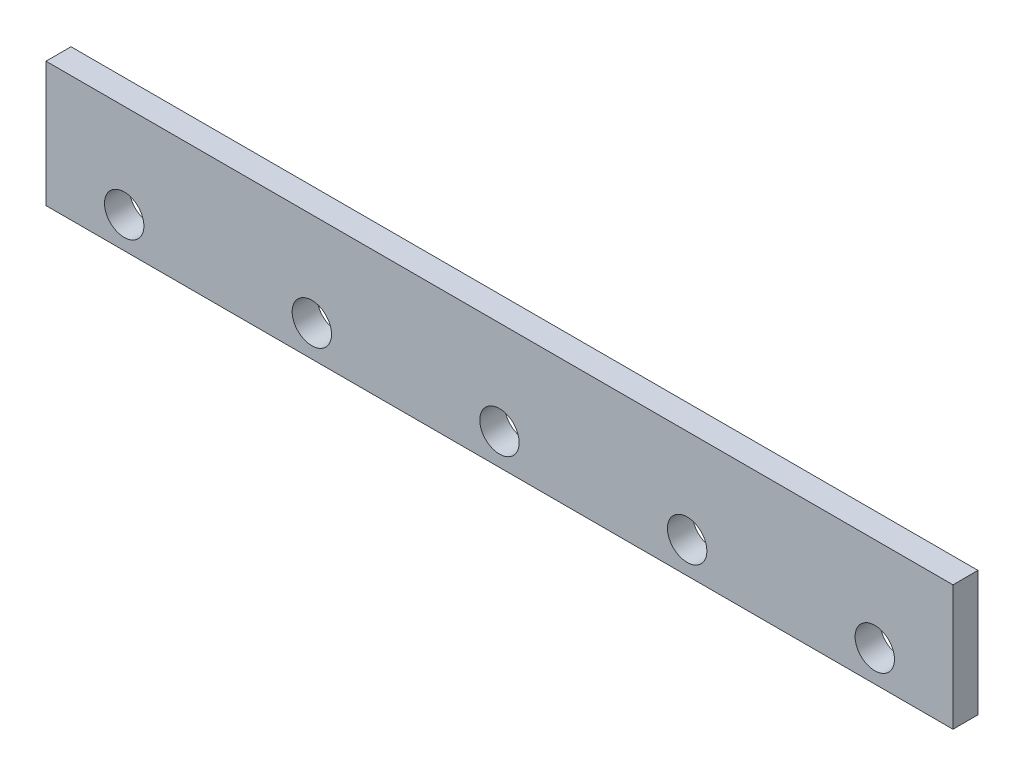
ISO-10303-21;
HEADER;
FILE_DESCRIPTION(('STEP AP214'),'2;1');
FILE_NAME('part.step','',(''),(''),'','','');
FILE_SCHEMA(('AUTOMOTIVE_DESIGN { 1 0 10303 214 1 1 1 1 }'));
ENDSEC;
DATA;
#1=APPLICATION_CONTEXT('core data for automotive mechanical design processes');
#2=APPLICATION_PROTOCOL_DEFINITION('international standard','automotive_design',2000,#1);
#3=PRODUCT_CONTEXT('',#1,'mechanical');
#4=PRODUCT('Part','Part','',(#3));
#5=PRODUCT_RELATED_PRODUCT_CATEGORY('part','',(#4));
#6=PRODUCT_DEFINITION_FORMATION('','',#4);
#7=PRODUCT_DEFINITION_CONTEXT('part definition',#1,'design');
#8=PRODUCT_DEFINITION('design','',#6,#7);
#9=PRODUCT_DEFINITION_SHAPE('','',#8);
#10=(LENGTH_UNIT() NAMED_UNIT(*) SI_UNIT(.MILLI.,.METRE.));
#11=(NAMED_UNIT(*) PLANE_ANGLE_UNIT() SI_UNIT($,.RADIAN.));
#12=(NAMED_UNIT(*) SI_UNIT($,.STERADIAN.) SOLID_ANGLE_UNIT());
#13=UNCERTAINTY_MEASURE_WITH_UNIT(LENGTH_MEASURE(1.E-05),#10,'distance_accuracy_value','');
#14=(GEOMETRIC_REPRESENTATION_CONTEXT(3) GLOBAL_UNCERTAINTY_ASSIGNED_CONTEXT((#13)) GLOBAL_UNIT_ASSIGNED_CONTEXT((#10,
#11,#12)) REPRESENTATION_CONTEXT('',''));
#15=CARTESIAN_POINT('',(0.,0.,0.));
#16=DIRECTION('',(0.,0.,1.));
#17=DIRECTION('',(1.,0.,0.));
#18=AXIS2_PLACEMENT_3D('',#15,#16,#17);
#19=CARTESIAN_POINT('',(0.,0.,16.));
#20=DIRECTION('',(0.,1.,0.));
#21=DIRECTION('',(0.,0.,1.));
#22=AXIS2_PLACEMENT_3D('',#19,#20,#21);
#23=PLANE('',#22);
#24=DIRECTION('',(1.,0.,0.));
#25=VECTOR('',#24,1.);
#26=CARTESIAN_POINT('',(0.,0.,0.));
#27=LINE('',#26,#25);
#28=CARTESIAN_POINT('',(0.,0.,0.));
#29=VERTEX_POINT('',#28);
#30=CARTESIAN_POINT('',(580.,0.,0.));
#31=VERTEX_POINT('',#30);
#32=EDGE_CURVE('E118',#29,#31,#27,.T.);
#33=ORIENTED_EDGE('',*,*,#32,.T.);
#34=DIRECTION('',(0.,0.,-1.));
#35=VECTOR('',#34,1.);
#36=CARTESIAN_POINT('',(580.,0.,16.));
#37=LINE('',#36,#35);
#38=CARTESIAN_POINT('',(580.,0.,16.));
#39=VERTEX_POINT('',#38);
#40=EDGE_CURVE('E11',#39,#31,#37,.T.);
#41=ORIENTED_EDGE('',*,*,#40,.F.);
#42=DIRECTION('',(1.,0.,0.));
#43=VECTOR('',#42,1.);
#44=CARTESIAN_POINT('',(0.,0.,16.));
#45=LINE('',#44,#43);
#46=CARTESIAN_POINT('',(0.,0.,16.));
#47=VERTEX_POINT('',#46);
#48=EDGE_CURVE('E89',#47,#39,#45,.T.);
#49=ORIENTED_EDGE('',*,*,#48,.F.);
#50=DIRECTION('',(0.,0.,-1.));
#51=VECTOR('',#50,1.);
#52=CARTESIAN_POINT('',(0.,0.,16.));
#53=LINE('',#52,#51);
#54=EDGE_CURVE('E56',#47,#29,#53,.T.);
#55=ORIENTED_EDGE('',*,*,#54,.T.);
#56=EDGE_LOOP('',(#33,#41,#49,#55));
#57=FACE_BOUND('',#56,.T.);
#58=ADVANCED_FACE('F39',(#57),#23,.F.);
#59=CARTESIAN_POINT('',(580.,0.,16.));
#60=DIRECTION('',(-1.,0.,0.));
#61=DIRECTION('',(0.,0.,1.));
#62=AXIS2_PLACEMENT_3D('',#59,#60,#61);
#63=PLANE('',#62);
#64=DIRECTION('',(0.,1.,0.));
#65=VECTOR('',#64,1.);
#66=CARTESIAN_POINT('',(580.,0.,0.));
#67=LINE('',#66,#65);
#68=CARTESIAN_POINT('',(580.,80.,0.));
#69=VERTEX_POINT('',#68);
#70=EDGE_CURVE('E94',#31,#69,#67,.T.);
#71=ORIENTED_EDGE('',*,*,#70,.T.);
#72=DIRECTION('',(0.,0.,-1.));
#73=VECTOR('',#72,1.);
#74=CARTESIAN_POINT('',(580.,80.,16.));
#75=LINE('',#74,#73);
#76=CARTESIAN_POINT('',(580.,80.,16.));
#77=VERTEX_POINT('',#76);
#78=EDGE_CURVE('E48',#77,#69,#75,.T.);
#79=ORIENTED_EDGE('',*,*,#78,.F.);
#80=DIRECTION('',(0.,1.,0.));
#81=VECTOR('',#80,1.);
#82=CARTESIAN_POINT('',(580.,0.,16.));
#83=LINE('',#82,#81);
#84=EDGE_CURVE('E81',#39,#77,#83,.T.);
#85=ORIENTED_EDGE('',*,*,#84,.F.);
#86=ORIENTED_EDGE('',*,*,#40,.T.);
#87=EDGE_LOOP('',(#71,#79,#85,#86));
#88=FACE_BOUND('',#87,.T.);
#89=ADVANCED_FACE('F93',(#88),#63,.F.);
#90=CARTESIAN_POINT('',(0.,80.,16.));
#91=DIRECTION('',(0.,1.,0.));
#92=DIRECTION('',(0.,0.,1.));
#93=AXIS2_PLACEMENT_3D('',#90,#91,#92);
#94=PLANE('',#93);
#95=DIRECTION('',(1.,0.,0.));
#96=VECTOR('',#95,1.);
#97=CARTESIAN_POINT('',(0.,80.,0.));
#98=LINE('',#97,#96);
#99=CARTESIAN_POINT('',(0.,80.,0.));
#100=VERTEX_POINT('',#99);
#101=EDGE_CURVE('E121',#100,#69,#98,.T.);
#102=ORIENTED_EDGE('',*,*,#101,.F.);
#103=DIRECTION('',(0.,0.,-1.));
#104=VECTOR('',#103,1.);
#105=CARTESIAN_POINT('',(0.,80.,16.));
#106=LINE('',#105,#104);
#107=CARTESIAN_POINT('',(0.,80.,16.));
#108=VERTEX_POINT('',#107);
#109=EDGE_CURVE('E70',#108,#100,#106,.T.);
#110=ORIENTED_EDGE('',*,*,#109,.F.);
#111=DIRECTION('',(1.,0.,0.));
#112=VECTOR('',#111,1.);
#113=CARTESIAN_POINT('',(0.,80.,16.));
#114=LINE('',#113,#112);
#115=EDGE_CURVE('E88',#108,#77,#114,.T.);
#116=ORIENTED_EDGE('',*,*,#115,.T.);
#117=ORIENTED_EDGE('',*,*,#78,.T.);
#118=EDGE_LOOP('',(#102,#110,#116,#117));
#119=FACE_BOUND('',#118,.T.);
#120=ADVANCED_FACE('F97',(#119),#94,.T.);
#121=CARTESIAN_POINT('',(49.9999999999999,20.,16.));
#122=DIRECTION('',(0.,0.,-1.));
#123=DIRECTION('',(-1.,0.,0.));
#124=AXIS2_PLACEMENT_3D('',#121,#122,#123);
#125=CYLINDRICAL_SURFACE('',#124,12.6);
#126=CARTESIAN_POINT('',(49.9999999999999,20.,16.));
#127=DIRECTION('',(0.,0.,1.));
#128=DIRECTION('',(1.,0.,0.));
#129=AXIS2_PLACEMENT_3D('',#126,#127,#128);
#130=CIRCLE('',#129,12.6);
#131=CARTESIAN_POINT('',(62.5999999999999,20.,16.));
#132=VERTEX_POINT('',#131);
#133=EDGE_CURVE('E143',#132,#132,#130,.T.);
#134=ORIENTED_EDGE('',*,*,#133,.T.);
#135=EDGE_LOOP('',(#134));
#136=FACE_BOUND('',#135,.T.);
#137=CARTESIAN_POINT('',(49.9999999999999,20.,0.));
#138=DIRECTION('',(0.,0.,1.));
#139=DIRECTION('',(1.,0.,0.));
#140=AXIS2_PLACEMENT_3D('',#137,#138,#139);
#141=CIRCLE('',#140,12.6);
#142=CARTESIAN_POINT('',(62.5999999999999,20.,0.));
#143=VERTEX_POINT('',#142);
#144=EDGE_CURVE('E115',#143,#143,#141,.T.);
#145=ORIENTED_EDGE('',*,*,#144,.F.);
#146=EDGE_LOOP('',(#145));
#147=FACE_BOUND('',#146,.T.);
#148=ADVANCED_FACE('F147',(#136,#147),#125,.F.);
#149=CARTESIAN_POINT('',(170.,20.,16.));
#150=DIRECTION('',(0.,0.,-1.));
#151=DIRECTION('',(-1.,0.,0.));
#152=AXIS2_PLACEMENT_3D('',#149,#150,#151);
#153=CYLINDRICAL_SURFACE('',#152,12.6);
#154=CARTESIAN_POINT('',(170.,20.,16.));
#155=DIRECTION('',(0.,0.,1.));
#156=DIRECTION('',(1.,0.,0.));
#157=AXIS2_PLACEMENT_3D('',#154,#155,#156);
#158=CIRCLE('',#157,12.6);
#159=CARTESIAN_POINT('',(182.6,20.,16.));
#160=VERTEX_POINT('',#159);
#161=EDGE_CURVE('E140',#160,#160,#158,.T.);
#162=ORIENTED_EDGE('',*,*,#161,.T.);
#163=EDGE_LOOP('',(#162));
#164=FACE_BOUND('',#163,.T.);
#165=CARTESIAN_POINT('',(170.,20.,0.));
#166=DIRECTION('',(0.,0.,1.));
#167=DIRECTION('',(1.,0.,0.));
#168=AXIS2_PLACEMENT_3D('',#165,#166,#167);
#169=CIRCLE('',#168,12.6);
#170=CARTESIAN_POINT('',(182.6,20.,0.));
#171=VERTEX_POINT('',#170);
#172=EDGE_CURVE('E112',#171,#171,#169,.T.);
#173=ORIENTED_EDGE('',*,*,#172,.F.);
#174=EDGE_LOOP('',(#173));
#175=FACE_BOUND('',#174,.T.);
#176=ADVANCED_FACE('F173',(#164,#175),#153,.F.);
#177=CARTESIAN_POINT('',(290.,20.,16.));
#178=DIRECTION('',(0.,0.,-1.));
#179=DIRECTION('',(-1.,0.,0.));
#180=AXIS2_PLACEMENT_3D('',#177,#178,#179);
#181=CYLINDRICAL_SURFACE('',#180,12.6);
#182=CARTESIAN_POINT('',(290.,20.,16.));
#183=DIRECTION('',(0.,0.,1.));
#184=DIRECTION('',(1.,0.,0.));
#185=AXIS2_PLACEMENT_3D('',#182,#183,#184);
#186=CIRCLE('',#185,12.6);
#187=CARTESIAN_POINT('',(302.6,20.,16.));
#188=VERTEX_POINT('',#187);
#189=EDGE_CURVE('E135',#188,#188,#186,.T.);
#190=ORIENTED_EDGE('',*,*,#189,.T.);
#191=EDGE_LOOP('',(#190));
#192=FACE_BOUND('',#191,.T.);
#193=CARTESIAN_POINT('',(290.,20.,0.));
#194=DIRECTION('',(0.,0.,1.));
#195=DIRECTION('',(1.,0.,0.));
#196=AXIS2_PLACEMENT_3D('',#193,#194,#195);
#197=CIRCLE('',#196,12.6);
#198=CARTESIAN_POINT('',(302.6,20.,0.));
#199=VERTEX_POINT('',#198);
#200=EDGE_CURVE('E109',#199,#199,#197,.T.);
#201=ORIENTED_EDGE('',*,*,#200,.F.);
#202=EDGE_LOOP('',(#201));
#203=FACE_BOUND('',#202,.T.);
#204=ADVANCED_FACE('F176',(#192,#203),#181,.F.);
#205=CARTESIAN_POINT('',(410.,20.,16.));
#206=DIRECTION('',(0.,0.,-1.));
#207=DIRECTION('',(-1.,0.,0.));
#208=AXIS2_PLACEMENT_3D('',#205,#206,#207);
#209=CYLINDRICAL_SURFACE('',#208,12.6);
#210=CARTESIAN_POINT('',(410.,20.,16.));
#211=DIRECTION('',(0.,0.,1.));
#212=DIRECTION('',(1.,0.,0.));
#213=AXIS2_PLACEMENT_3D('',#210,#211,#212);
#214=CIRCLE('',#213,12.6);
#215=CARTESIAN_POINT('',(422.6,20.,16.));
#216=VERTEX_POINT('',#215);
#217=EDGE_CURVE('E130',#216,#216,#214,.T.);
#218=ORIENTED_EDGE('',*,*,#217,.T.);
#219=EDGE_LOOP('',(#218));
#220=FACE_BOUND('',#219,.T.);
#221=CARTESIAN_POINT('',(410.,20.,0.));
#222=DIRECTION('',(0.,0.,1.));
#223=DIRECTION('',(1.,0.,0.));
#224=AXIS2_PLACEMENT_3D('',#221,#222,#223);
#225=CIRCLE('',#224,12.6);
#226=CARTESIAN_POINT('',(422.6,20.,0.));
#227=VERTEX_POINT('',#226);
#228=EDGE_CURVE('E106',#227,#227,#225,.T.);
#229=ORIENTED_EDGE('',*,*,#228,.F.);
#230=EDGE_LOOP('',(#229));
#231=FACE_BOUND('',#230,.T.);
#232=ADVANCED_FACE('F179',(#220,#231),#209,.F.);
#233=CARTESIAN_POINT('',(530.,20.,16.));
#234=DIRECTION('',(0.,0.,-1.));
#235=DIRECTION('',(-1.,0.,0.));
#236=AXIS2_PLACEMENT_3D('',#233,#234,#235);
#237=CYLINDRICAL_SURFACE('',#236,12.6000000000001);
#238=CARTESIAN_POINT('',(530.,20.,16.));
#239=DIRECTION('',(0.,0.,1.));
#240=DIRECTION('',(1.,0.,0.));
#241=AXIS2_PLACEMENT_3D('',#238,#239,#240);
#242=CIRCLE('',#241,12.6000000000001);
#243=CARTESIAN_POINT('',(542.6,20.,16.));
#244=VERTEX_POINT('',#243);
#245=EDGE_CURVE('E126',#244,#244,#242,.T.);
#246=ORIENTED_EDGE('',*,*,#245,.T.);
#247=EDGE_LOOP('',(#246));
#248=FACE_BOUND('',#247,.T.);
#249=CARTESIAN_POINT('',(530.,20.,0.));
#250=DIRECTION('',(0.,0.,1.));
#251=DIRECTION('',(1.,0.,0.));
#252=AXIS2_PLACEMENT_3D('',#249,#250,#251);
#253=CIRCLE('',#252,12.6000000000001);
#254=CARTESIAN_POINT('',(542.6,20.,0.));
#255=VERTEX_POINT('',#254);
#256=EDGE_CURVE('E103',#255,#255,#253,.T.);
#257=ORIENTED_EDGE('',*,*,#256,.F.);
#258=EDGE_LOOP('',(#257));
#259=FACE_BOUND('',#258,.T.);
#260=ADVANCED_FACE('F41',(#248,#259),#237,.F.);
#261=CARTESIAN_POINT('',(0.,0.,16.));
#262=DIRECTION('',(-1.,0.,0.));
#263=DIRECTION('',(0.,0.,1.));
#264=AXIS2_PLACEMENT_3D('',#261,#262,#263);
#265=PLANE('',#264);
#266=DIRECTION('',(0.,1.,0.));
#267=VECTOR('',#266,1.);
#268=CARTESIAN_POINT('',(0.,0.,0.));
#269=LINE('',#268,#267);
#270=EDGE_CURVE('E123',#29,#100,#269,.T.);
#271=ORIENTED_EDGE('',*,*,#270,.F.);
#272=ORIENTED_EDGE('',*,*,#54,.F.);
#273=DIRECTION('',(0.,1.,0.));
#274=VECTOR('',#273,1.);
#275=CARTESIAN_POINT('',(0.,0.,16.));
#276=LINE('',#275,#274);
#277=EDGE_CURVE('E98',#47,#108,#276,.T.);
#278=ORIENTED_EDGE('',*,*,#277,.T.);
#279=ORIENTED_EDGE('',*,*,#109,.T.);
#280=EDGE_LOOP('',(#271,#272,#278,#279));
#281=FACE_BOUND('',#280,.T.);
#282=ADVANCED_FACE('F152',(#281),#265,.T.);
#283=CARTESIAN_POINT('',(0.,0.,16.));
#284=DIRECTION('',(0.,0.,1.));
#285=DIRECTION('',(1.,0.,0.));
#286=AXIS2_PLACEMENT_3D('',#283,#284,#285);
#287=PLANE('',#286);
#288=ORIENTED_EDGE('',*,*,#245,.F.);
#289=EDGE_LOOP('',(#288));
#290=FACE_BOUND('',#289,.T.);
#291=ORIENTED_EDGE('',*,*,#217,.F.);
#292=EDGE_LOOP('',(#291));
#293=FACE_BOUND('',#292,.T.);
#294=ORIENTED_EDGE('',*,*,#189,.F.);
#295=EDGE_LOOP('',(#294));
#296=FACE_BOUND('',#295,.T.);
#297=ORIENTED_EDGE('',*,*,#161,.F.);
#298=EDGE_LOOP('',(#297));
#299=FACE_BOUND('',#298,.T.);
#300=ORIENTED_EDGE('',*,*,#133,.F.);
#301=EDGE_LOOP('',(#300));
#302=FACE_BOUND('',#301,.T.);
#303=ORIENTED_EDGE('',*,*,#48,.T.);
#304=ORIENTED_EDGE('',*,*,#84,.T.);
#305=ORIENTED_EDGE('',*,*,#115,.F.);
#306=ORIENTED_EDGE('',*,*,#277,.F.);
#307=EDGE_LOOP('',(#303,#304,#305,#306));
#308=FACE_BOUND('',#307,.T.);
#309=ADVANCED_FACE('F85',(#290,#293,#296,#299,#302,#308),#287,.T.);
#310=CARTESIAN_POINT('',(0.,0.,0.));
#311=DIRECTION('',(0.,0.,1.));
#312=DIRECTION('',(1.,0.,0.));
#313=AXIS2_PLACEMENT_3D('',#310,#311,#312);
#314=PLANE('',#313);
#315=ORIENTED_EDGE('',*,*,#256,.T.);
#316=EDGE_LOOP('',(#315));
#317=FACE_BOUND('',#316,.T.);
#318=ORIENTED_EDGE('',*,*,#228,.T.);
#319=EDGE_LOOP('',(#318));
#320=FACE_BOUND('',#319,.T.);
#321=ORIENTED_EDGE('',*,*,#200,.T.);
#322=EDGE_LOOP('',(#321));
#323=FACE_BOUND('',#322,.T.);
#324=ORIENTED_EDGE('',*,*,#172,.T.);
#325=EDGE_LOOP('',(#324));
#326=FACE_BOUND('',#325,.T.);
#327=ORIENTED_EDGE('',*,*,#144,.T.);
#328=EDGE_LOOP('',(#327));
#329=FACE_BOUND('',#328,.T.);
#330=ORIENTED_EDGE('',*,*,#32,.F.);
#331=ORIENTED_EDGE('',*,*,#270,.T.);
#332=ORIENTED_EDGE('',*,*,#101,.T.);
#333=ORIENTED_EDGE('',*,*,#70,.F.);
#334=EDGE_LOOP('',(#330,#331,#332,#333));
#335=FACE_BOUND('',#334,.T.);
#336=ADVANCED_FACE('F151',(#317,#320,#323,#326,#329,#335),#314,.F.);
#337=CLOSED_SHELL('',(#58,#89,#120,#148,#176,#204,#232,#260,#282,#309,#336));
#338=MANIFOLD_SOLID_BREP('B2',#337);
#339=ADVANCED_BREP_SHAPE_REPRESENTATION('',(#18,#338),#14);
#340=SHAPE_DEFINITION_REPRESENTATION(#9,#339);
ENDSEC;
END-ISO-10303-21;
